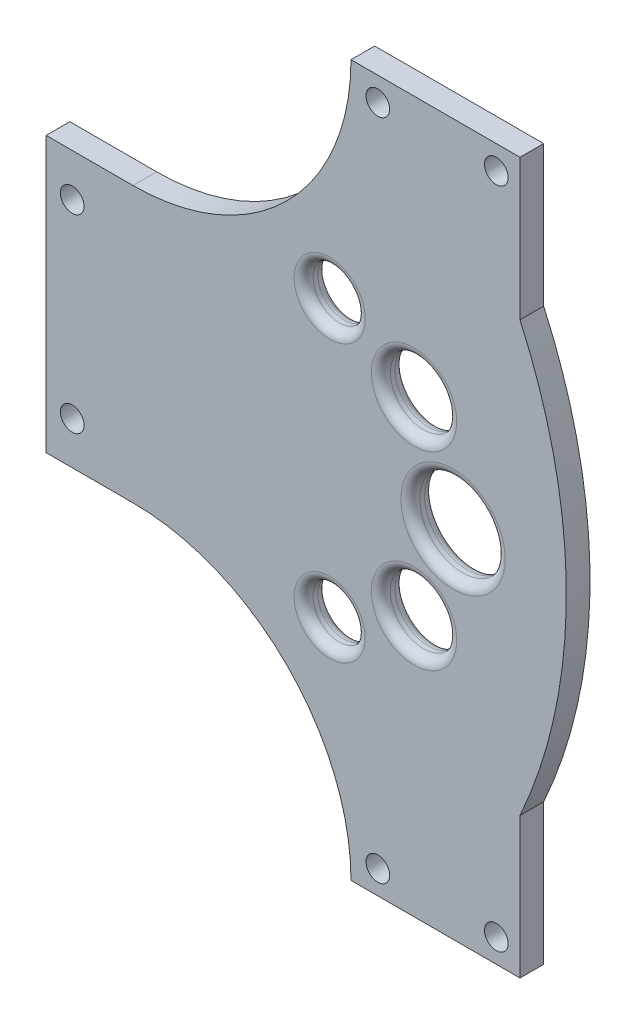
ISO-10303-21;
HEADER;
FILE_DESCRIPTION(('STEP AP214'),'2;1');
FILE_NAME('part.step','',(''),(''),'','','');
FILE_SCHEMA(('AUTOMOTIVE_DESIGN { 1 0 10303 214 1 1 1 1 }'));
ENDSEC;
DATA;
#1=APPLICATION_CONTEXT('core data for automotive mechanical design processes');
#2=APPLICATION_PROTOCOL_DEFINITION('international standard','automotive_design',2000,#1);
#3=PRODUCT_CONTEXT('',#1,'mechanical');
#4=PRODUCT('Part','Part','',(#3));
#5=PRODUCT_RELATED_PRODUCT_CATEGORY('part','',(#4));
#6=PRODUCT_DEFINITION_FORMATION('','',#4);
#7=PRODUCT_DEFINITION_CONTEXT('part definition',#1,'design');
#8=PRODUCT_DEFINITION('design','',#6,#7);
#9=PRODUCT_DEFINITION_SHAPE('','',#8);
#10=(LENGTH_UNIT() NAMED_UNIT(*) SI_UNIT(.MILLI.,.METRE.));
#11=(NAMED_UNIT(*) PLANE_ANGLE_UNIT() SI_UNIT($,.RADIAN.));
#12=(NAMED_UNIT(*) SI_UNIT($,.STERADIAN.) SOLID_ANGLE_UNIT());
#13=UNCERTAINTY_MEASURE_WITH_UNIT(LENGTH_MEASURE(1.E-05),#10,'distance_accuracy_value','');
#14=(GEOMETRIC_REPRESENTATION_CONTEXT(3) GLOBAL_UNCERTAINTY_ASSIGNED_CONTEXT((#13)) GLOBAL_UNIT_ASSIGNED_CONTEXT((#10,
#11,#12)) REPRESENTATION_CONTEXT('',''));
#15=CARTESIAN_POINT('',(0.,0.,0.));
#16=DIRECTION('',(0.,0.,1.));
#17=DIRECTION('',(1.,0.,0.));
#18=AXIS2_PLACEMENT_3D('',#15,#16,#17);
#19=CARTESIAN_POINT('',(0.,0.,5.));
#20=DIRECTION('',(0.,1.,0.));
#21=DIRECTION('',(-1.,0.,0.));
#22=AXIS2_PLACEMENT_3D('',#19,#20,#21);
#23=PLANE('',#22);
#24=DIRECTION('',(1.,0.,0.));
#25=VECTOR('',#24,1.);
#26=CARTESIAN_POINT('',(0.,0.,0.));
#27=LINE('',#26,#25);
#28=CARTESIAN_POINT('',(0.,0.,0.));
#29=VERTEX_POINT('',#28);
#30=CARTESIAN_POINT('',(18.3344584571435,0.,0.));
#31=VERTEX_POINT('',#30);
#32=EDGE_CURVE('E150',#29,#31,#27,.T.);
#33=ORIENTED_EDGE('',*,*,#32,.T.);
#34=DIRECTION('',(0.,0.,-1.));
#35=VECTOR('',#34,1.);
#36=CARTESIAN_POINT('',(18.3344584571435,0.,5.));
#37=LINE('',#36,#35);
#38=CARTESIAN_POINT('',(18.3344584571435,0.,5.));
#39=VERTEX_POINT('',#38);
#40=EDGE_CURVE('E188',#39,#31,#37,.T.);
#41=ORIENTED_EDGE('',*,*,#40,.F.);
#42=DIRECTION('',(1.,0.,0.));
#43=VECTOR('',#42,1.);
#44=CARTESIAN_POINT('',(0.,0.,5.));
#45=LINE('',#44,#43);
#46=CARTESIAN_POINT('',(0.,0.,5.));
#47=VERTEX_POINT('',#46);
#48=EDGE_CURVE('E169',#47,#39,#45,.T.);
#49=ORIENTED_EDGE('',*,*,#48,.F.);
#50=DIRECTION('',(0.,0.,-1.));
#51=VECTOR('',#50,1.);
#52=CARTESIAN_POINT('',(0.,0.,5.));
#53=LINE('',#52,#51);
#54=EDGE_CURVE('E146',#47,#29,#53,.T.);
#55=ORIENTED_EDGE('',*,*,#54,.T.);
#56=EDGE_LOOP('',(#33,#41,#49,#55));
#57=FACE_BOUND('',#56,.T.);
#58=ADVANCED_FACE('F38',(#57),#23,.F.);
#59=CARTESIAN_POINT('',(18.3344584571435,-46.,5.));
#60=DIRECTION('',(0.,0.,-1.));
#61=DIRECTION('',(-1.,0.,0.));
#62=AXIS2_PLACEMENT_3D('',#59,#60,#61);
#63=CYLINDRICAL_SURFACE('',#62,46.);
#64=CARTESIAN_POINT('',(18.3344584571435,-46.,0.));
#65=DIRECTION('',(0.,0.,-1.));
#66=DIRECTION('',(1.,0.,0.));
#67=AXIS2_PLACEMENT_3D('',#64,#65,#66);
#68=CIRCLE('',#67,46.);
#69=CARTESIAN_POINT('',(64.3344584571435,-46.,0.));
#70=VERTEX_POINT('',#69);
#71=EDGE_CURVE('E153',#31,#70,#68,.T.);
#72=ORIENTED_EDGE('',*,*,#71,.T.);
#73=DIRECTION('',(0.,0.,-1.));
#74=VECTOR('',#73,1.);
#75=CARTESIAN_POINT('',(64.3344584571435,-46.,5.));
#76=LINE('',#75,#74);
#77=CARTESIAN_POINT('',(64.3344584571435,-46.,5.));
#78=VERTEX_POINT('',#77);
#79=EDGE_CURVE('E185',#78,#70,#76,.T.);
#80=ORIENTED_EDGE('',*,*,#79,.F.);
#81=CARTESIAN_POINT('',(18.3344584571435,-46.,5.));
#82=DIRECTION('',(0.,0.,-1.));
#83=DIRECTION('',(1.,0.,0.));
#84=AXIS2_PLACEMENT_3D('',#81,#82,#83);
#85=CIRCLE('',#84,46.);
#86=EDGE_CURVE('E107',#39,#78,#85,.T.);
#87=ORIENTED_EDGE('',*,*,#86,.F.);
#88=ORIENTED_EDGE('',*,*,#40,.T.);
#89=EDGE_LOOP('',(#72,#80,#87,#88));
#90=FACE_BOUND('',#89,.T.);
#91=ADVANCED_FACE('F313',(#90),#63,.F.);
#92=CARTESIAN_POINT('',(64.3344584571435,-46.,5.));
#93=DIRECTION('',(0.,1.,0.));
#94=DIRECTION('',(-1.,0.,0.));
#95=AXIS2_PLACEMENT_3D('',#92,#93,#94);
#96=PLANE('',#95);
#97=DIRECTION('',(1.,0.,0.));
#98=VECTOR('',#97,1.);
#99=CARTESIAN_POINT('',(64.3344584571435,-46.,0.));
#100=LINE('',#99,#98);
#101=CARTESIAN_POINT('',(100.,-46.,0.));
#102=VERTEX_POINT('',#101);
#103=EDGE_CURVE('E156',#70,#102,#100,.T.);
#104=ORIENTED_EDGE('',*,*,#103,.T.);
#105=DIRECTION('',(0.,0.,-1.));
#106=VECTOR('',#105,1.);
#107=CARTESIAN_POINT('',(100.,-46.,5.));
#108=LINE('',#107,#106);
#109=CARTESIAN_POINT('',(100.,-46.,5.));
#110=VERTEX_POINT('',#109);
#111=EDGE_CURVE('E182',#110,#102,#108,.T.);
#112=ORIENTED_EDGE('',*,*,#111,.F.);
#113=DIRECTION('',(1.,0.,0.));
#114=VECTOR('',#113,1.);
#115=CARTESIAN_POINT('',(64.3344584571435,-46.,5.));
#116=LINE('',#115,#114);
#117=EDGE_CURVE('E276',#78,#110,#116,.T.);
#118=ORIENTED_EDGE('',*,*,#117,.F.);
#119=ORIENTED_EDGE('',*,*,#79,.T.);
#120=EDGE_LOOP('',(#104,#112,#118,#119));
#121=FACE_BOUND('',#120,.T.);
#122=ADVANCED_FACE('F318',(#121),#96,.F.);
#123=CARTESIAN_POINT('',(100.,-46.,5.));
#124=DIRECTION('',(-1.,0.,0.));
#125=DIRECTION('',(0.,0.,1.));
#126=AXIS2_PLACEMENT_3D('',#123,#124,#125);
#127=PLANE('',#126);
#128=DIRECTION('',(0.,1.,0.));
#129=VECTOR('',#128,1.);
#130=CARTESIAN_POINT('',(100.,-46.,0.));
#131=LINE('',#130,#129);
#132=CARTESIAN_POINT('',(100.,-16.2880938118282,0.));
#133=VERTEX_POINT('',#132);
#134=EDGE_CURVE('E158',#102,#133,#131,.T.);
#135=ORIENTED_EDGE('',*,*,#134,.T.);
#136=DIRECTION('',(0.,0.,-1.));
#137=VECTOR('',#136,1.);
#138=CARTESIAN_POINT('',(100.,-16.2880938118282,5.));
#139=LINE('',#138,#137);
#140=CARTESIAN_POINT('',(100.,-16.2880938118282,5.));
#141=VERTEX_POINT('',#140);
#142=EDGE_CURVE('E179',#141,#133,#139,.T.);
#143=ORIENTED_EDGE('',*,*,#142,.F.);
#144=DIRECTION('',(0.,1.,0.));
#145=VECTOR('',#144,1.);
#146=CARTESIAN_POINT('',(100.,-46.,5.));
#147=LINE('',#146,#145);
#148=EDGE_CURVE('E278',#110,#141,#147,.T.);
#149=ORIENTED_EDGE('',*,*,#148,.F.);
#150=ORIENTED_EDGE('',*,*,#111,.T.);
#151=EDGE_LOOP('',(#135,#143,#149,#150));
#152=FACE_BOUND('',#151,.T.);
#153=ADVANCED_FACE('F641',(#152),#127,.F.);
#154=CARTESIAN_POINT('',(0.,29.,5.));
#155=DIRECTION('',(0.,0.,-1.));
#156=DIRECTION('',(-1.,0.,0.));
#157=AXIS2_PLACEMENT_3D('',#154,#155,#156);
#158=CYLINDRICAL_SURFACE('',#157,109.777098891841);
#159=CARTESIAN_POINT('',(0.,29.,0.));
#160=DIRECTION('',(0.,0.,1.));
#161=DIRECTION('',(-1.,0.,0.));
#162=AXIS2_PLACEMENT_3D('',#159,#160,#161);
#163=CIRCLE('',#162,109.777098891841);
#164=CARTESIAN_POINT('',(100.,74.2880938118283,0.));
#165=VERTEX_POINT('',#164);
#166=EDGE_CURVE('E160',#133,#165,#163,.T.);
#167=ORIENTED_EDGE('',*,*,#166,.T.);
#168=DIRECTION('',(0.,0.,-1.));
#169=VECTOR('',#168,1.);
#170=CARTESIAN_POINT('',(100.,74.2880938118283,5.));
#171=LINE('',#170,#169);
#172=CARTESIAN_POINT('',(100.,74.2880938118283,5.));
#173=VERTEX_POINT('',#172);
#174=EDGE_CURVE('E176',#173,#165,#171,.T.);
#175=ORIENTED_EDGE('',*,*,#174,.F.);
#176=CARTESIAN_POINT('',(0.,29.,5.));
#177=DIRECTION('',(0.,0.,1.));
#178=DIRECTION('',(-1.,0.,0.));
#179=AXIS2_PLACEMENT_3D('',#176,#177,#178);
#180=CIRCLE('',#179,109.777098891841);
#181=EDGE_CURVE('E280',#141,#173,#180,.T.);
#182=ORIENTED_EDGE('',*,*,#181,.F.);
#183=ORIENTED_EDGE('',*,*,#142,.T.);
#184=EDGE_LOOP('',(#167,#175,#182,#183));
#185=FACE_BOUND('',#184,.T.);
#186=ADVANCED_FACE('F633',(#185),#158,.T.);
#187=CARTESIAN_POINT('',(100.,104.,5.));
#188=DIRECTION('',(-1.,0.,0.));
#189=DIRECTION('',(0.,0.,1.));
#190=AXIS2_PLACEMENT_3D('',#187,#188,#189);
#191=PLANE('',#190);
#192=DIRECTION('',(0.,1.,0.));
#193=VECTOR('',#192,1.);
#194=CARTESIAN_POINT('',(100.,104.,0.));
#195=LINE('',#194,#193);
#196=CARTESIAN_POINT('',(100.,104.,0.));
#197=VERTEX_POINT('',#196);
#198=EDGE_CURVE('E162',#165,#197,#195,.T.);
#199=ORIENTED_EDGE('',*,*,#198,.T.);
#200=DIRECTION('',(0.,0.,-1.));
#201=VECTOR('',#200,1.);
#202=CARTESIAN_POINT('',(100.,104.,5.));
#203=LINE('',#202,#201);
#204=CARTESIAN_POINT('',(100.,104.,5.));
#205=VERTEX_POINT('',#204);
#206=EDGE_CURVE('E173',#205,#197,#203,.T.);
#207=ORIENTED_EDGE('',*,*,#206,.F.);
#208=DIRECTION('',(0.,1.,0.));
#209=VECTOR('',#208,1.);
#210=CARTESIAN_POINT('',(100.,104.,5.));
#211=LINE('',#210,#209);
#212=EDGE_CURVE('E282',#173,#205,#211,.T.);
#213=ORIENTED_EDGE('',*,*,#212,.F.);
#214=ORIENTED_EDGE('',*,*,#174,.T.);
#215=EDGE_LOOP('',(#199,#207,#213,#214));
#216=FACE_BOUND('',#215,.T.);
#217=ADVANCED_FACE('F288',(#216),#191,.F.);
#218=CARTESIAN_POINT('',(64.3344584571435,104.,5.));
#219=DIRECTION('',(0.,-1.,0.));
#220=DIRECTION('',(1.,0.,0.));
#221=AXIS2_PLACEMENT_3D('',#218,#219,#220);
#222=PLANE('',#221);
#223=DIRECTION('',(-1.,0.,0.));
#224=VECTOR('',#223,1.);
#225=CARTESIAN_POINT('',(64.3344584571435,104.,0.));
#226=LINE('',#225,#224);
#227=CARTESIAN_POINT('',(64.3344584571435,104.,0.));
#228=VERTEX_POINT('',#227);
#229=EDGE_CURVE('E164',#197,#228,#226,.T.);
#230=ORIENTED_EDGE('',*,*,#229,.T.);
#231=DIRECTION('',(0.,0.,-1.));
#232=VECTOR('',#231,1.);
#233=CARTESIAN_POINT('',(64.3344584571435,104.,5.));
#234=LINE('',#233,#232);
#235=CARTESIAN_POINT('',(64.3344584571435,104.,5.));
#236=VERTEX_POINT('',#235);
#237=EDGE_CURVE('E141',#236,#228,#234,.T.);
#238=ORIENTED_EDGE('',*,*,#237,.F.);
#239=DIRECTION('',(-1.,0.,0.));
#240=VECTOR('',#239,1.);
#241=CARTESIAN_POINT('',(64.3344584571435,104.,5.));
#242=LINE('',#241,#240);
#243=EDGE_CURVE('E132',#205,#236,#242,.T.);
#244=ORIENTED_EDGE('',*,*,#243,.F.);
#245=ORIENTED_EDGE('',*,*,#206,.T.);
#246=EDGE_LOOP('',(#230,#238,#244,#245));
#247=FACE_BOUND('',#246,.T.);
#248=ADVANCED_FACE('F292',(#247),#222,.F.);
#249=CARTESIAN_POINT('',(18.3344584571435,104.,5.));
#250=DIRECTION('',(0.,0.,-1.));
#251=DIRECTION('',(-1.,0.,0.));
#252=AXIS2_PLACEMENT_3D('',#249,#250,#251);
#253=CYLINDRICAL_SURFACE('',#252,46.);
#254=CARTESIAN_POINT('',(18.3344584571435,104.,0.));
#255=DIRECTION('',(0.,0.,-1.));
#256=DIRECTION('',(-1.,0.,0.));
#257=AXIS2_PLACEMENT_3D('',#254,#255,#256);
#258=CIRCLE('',#257,46.);
#259=CARTESIAN_POINT('',(18.3344584571435,58.,0.));
#260=VERTEX_POINT('',#259);
#261=EDGE_CURVE('E140',#228,#260,#258,.T.);
#262=ORIENTED_EDGE('',*,*,#261,.T.);
#263=DIRECTION('',(0.,0.,-1.));
#264=VECTOR('',#263,1.);
#265=CARTESIAN_POINT('',(18.3344584571435,58.,5.));
#266=LINE('',#265,#264);
#267=CARTESIAN_POINT('',(18.3344584571435,58.,5.));
#268=VERTEX_POINT('',#267);
#269=EDGE_CURVE('E137',#268,#260,#266,.T.);
#270=ORIENTED_EDGE('',*,*,#269,.F.);
#271=CARTESIAN_POINT('',(18.3344584571435,104.,5.));
#272=DIRECTION('',(0.,0.,-1.));
#273=DIRECTION('',(-1.,0.,0.));
#274=AXIS2_PLACEMENT_3D('',#271,#272,#273);
#275=CIRCLE('',#274,46.);
#276=EDGE_CURVE('E126',#236,#268,#275,.T.);
#277=ORIENTED_EDGE('',*,*,#276,.F.);
#278=ORIENTED_EDGE('',*,*,#237,.T.);
#279=EDGE_LOOP('',(#262,#270,#277,#278));
#280=FACE_BOUND('',#279,.T.);
#281=ADVANCED_FACE('F138',(#280),#253,.F.);
#282=CARTESIAN_POINT('',(0.,58.,5.));
#283=DIRECTION('',(0.,-1.,0.));
#284=DIRECTION('',(0.,0.,-1.));
#285=AXIS2_PLACEMENT_3D('',#282,#283,#284);
#286=PLANE('',#285);
#287=DIRECTION('',(-1.,0.,0.));
#288=VECTOR('',#287,1.);
#289=CARTESIAN_POINT('',(0.,58.,0.));
#290=LINE('',#289,#288);
#291=CARTESIAN_POINT('',(0.,58.,0.));
#292=VERTEX_POINT('',#291);
#293=EDGE_CURVE('E92',#260,#292,#290,.T.);
#294=ORIENTED_EDGE('',*,*,#293,.T.);
#295=DIRECTION('',(0.,0.,-1.));
#296=VECTOR('',#295,1.);
#297=CARTESIAN_POINT('',(0.,58.,5.));
#298=LINE('',#297,#296);
#299=CARTESIAN_POINT('',(0.,58.,5.));
#300=VERTEX_POINT('',#299);
#301=EDGE_CURVE('E142',#300,#292,#298,.T.);
#302=ORIENTED_EDGE('',*,*,#301,.F.);
#303=DIRECTION('',(-1.,0.,0.));
#304=VECTOR('',#303,1.);
#305=CARTESIAN_POINT('',(0.,58.,5.));
#306=LINE('',#305,#304);
#307=EDGE_CURVE('E130',#268,#300,#306,.T.);
#308=ORIENTED_EDGE('',*,*,#307,.F.);
#309=ORIENTED_EDGE('',*,*,#269,.T.);
#310=EDGE_LOOP('',(#294,#302,#308,#309));
#311=FACE_BOUND('',#310,.T.);
#312=ADVANCED_FACE('F144',(#311),#286,.F.);
#313=CARTESIAN_POINT('',(0.,0.,5.));
#314=DIRECTION('',(1.,0.,0.));
#315=DIRECTION('',(0.,0.,-1.));
#316=AXIS2_PLACEMENT_3D('',#313,#314,#315);
#317=PLANE('',#316);
#318=DIRECTION('',(0.,-1.,0.));
#319=VECTOR('',#318,1.);
#320=CARTESIAN_POINT('',(0.,0.,0.));
#321=LINE('',#320,#319);
#322=EDGE_CURVE('E98',#292,#29,#321,.T.);
#323=ORIENTED_EDGE('',*,*,#322,.T.);
#324=ORIENTED_EDGE('',*,*,#54,.F.);
#325=DIRECTION('',(0.,-1.,0.));
#326=VECTOR('',#325,1.);
#327=CARTESIAN_POINT('',(0.,0.,5.));
#328=LINE('',#327,#326);
#329=EDGE_CURVE('E57',#300,#47,#328,.T.);
#330=ORIENTED_EDGE('',*,*,#329,.F.);
#331=ORIENTED_EDGE('',*,*,#301,.T.);
#332=EDGE_LOOP('',(#323,#324,#330,#331));
#333=FACE_BOUND('',#332,.T.);
#334=ADVANCED_FACE('F300',(#333),#317,.F.);
#335=CARTESIAN_POINT('',(18.3344584571435,-46.,5.));
#336=DIRECTION('',(0.,0.,1.));
#337=DIRECTION('',(1.,0.,0.));
#338=AXIS2_PLACEMENT_3D('',#335,#336,#337);
#339=PLANE('',#338);
#340=CARTESIAN_POINT('',(95.,-41.,5.));
#341=DIRECTION('',(0.,0.,1.));
#342=DIRECTION('',(1.,0.,0.));
#343=AXIS2_PLACEMENT_3D('',#340,#341,#342);
#344=CIRCLE('',#343,2.5);
#345=CARTESIAN_POINT('',(97.5,-41.,5.));
#346=VERTEX_POINT('',#345);
#347=EDGE_CURVE('E469',#346,#346,#344,.T.);
#348=ORIENTED_EDGE('',*,*,#347,.F.);
#349=EDGE_LOOP('',(#348));
#350=FACE_BOUND('',#349,.T.);
#351=CARTESIAN_POINT('',(70.,99.,5.));
#352=DIRECTION('',(0.,0.,1.));
#353=DIRECTION('',(-1.,0.,0.));
#354=AXIS2_PLACEMENT_3D('',#351,#352,#353);
#355=CIRCLE('',#354,2.5);
#356=CARTESIAN_POINT('',(67.5,99.,5.));
#357=VERTEX_POINT('',#356);
#358=EDGE_CURVE('E466',#357,#357,#355,.T.);
#359=ORIENTED_EDGE('',*,*,#358,.F.);
#360=EDGE_LOOP('',(#359));
#361=FACE_BOUND('',#360,.T.);
#362=CARTESIAN_POINT('',(95.,99.,5.));
#363=DIRECTION('',(0.,0.,1.));
#364=DIRECTION('',(-1.,0.,0.));
#365=AXIS2_PLACEMENT_3D('',#362,#363,#364);
#366=CIRCLE('',#365,2.5);
#367=CARTESIAN_POINT('',(92.5,99.,5.));
#368=VERTEX_POINT('',#367);
#369=EDGE_CURVE('E464',#368,#368,#366,.T.);
#370=ORIENTED_EDGE('',*,*,#369,.F.);
#371=EDGE_LOOP('',(#370));
#372=FACE_BOUND('',#371,.T.);
#373=CARTESIAN_POINT('',(70.,-41.,5.));
#374=DIRECTION('',(0.,0.,1.));
#375=DIRECTION('',(1.,0.,0.));
#376=AXIS2_PLACEMENT_3D('',#373,#374,#375);
#377=CIRCLE('',#376,2.5);
#378=CARTESIAN_POINT('',(72.5,-41.,5.));
#379=VERTEX_POINT('',#378);
#380=EDGE_CURVE('E256',#379,#379,#377,.T.);
#381=ORIENTED_EDGE('',*,*,#380,.F.);
#382=EDGE_LOOP('',(#381));
#383=FACE_BOUND('',#382,.T.);
#384=CARTESIAN_POINT('',(5.5,49.,5.));
#385=DIRECTION('',(0.,0.,1.));
#386=DIRECTION('',(1.,0.,0.));
#387=AXIS2_PLACEMENT_3D('',#384,#385,#386);
#388=CIRCLE('',#387,2.5);
#389=CARTESIAN_POINT('',(8.,49.,5.));
#390=VERTEX_POINT('',#389);
#391=EDGE_CURVE('E249',#390,#390,#388,.T.);
#392=ORIENTED_EDGE('',*,*,#391,.F.);
#393=EDGE_LOOP('',(#392));
#394=FACE_BOUND('',#393,.T.);
#395=CARTESIAN_POINT('',(5.50000000000001,8.99999999999999,5.));
#396=DIRECTION('',(0.,0.,1.));
#397=DIRECTION('',(1.,0.,0.));
#398=AXIS2_PLACEMENT_3D('',#395,#396,#397);
#399=CIRCLE('',#398,2.5);
#400=CARTESIAN_POINT('',(8.00000000000001,8.99999999999999,5.));
#401=VERTEX_POINT('',#400);
#402=EDGE_CURVE('E263',#401,#401,#399,.T.);
#403=ORIENTED_EDGE('',*,*,#402,.F.);
#404=EDGE_LOOP('',(#403));
#405=FACE_BOUND('',#404,.T.);
#406=CARTESIAN_POINT('',(59.840097388612,-0.167904281484152,5.));
#407=DIRECTION('',(0.,0.,1.));
#408=DIRECTION('',(1.,0.,0.));
#409=AXIS2_PLACEMENT_3D('',#406,#407,#408);
#410=CIRCLE('',#409,7.50000000000001);
#411=CARTESIAN_POINT('',(67.340097388612,-0.167904281484152,5.));
#412=VERTEX_POINT('',#411);
#413=EDGE_CURVE('E11',#412,#412,#410,.F.);
#414=ORIENTED_EDGE('',*,*,#413,.T.);
#415=EDGE_LOOP('',(#414));
#416=FACE_BOUND('',#415,.T.);
#417=CARTESIAN_POINT('',(77.6410161513774,8.99999999999999,5.));
#418=DIRECTION('',(0.,0.,1.));
#419=DIRECTION('',(1.,0.,0.));
#420=AXIS2_PLACEMENT_3D('',#417,#418,#419);
#421=CIRCLE('',#420,9.);
#422=CARTESIAN_POINT('',(86.6410161513774,8.99999999999999,5.));
#423=VERTEX_POINT('',#422);
#424=EDGE_CURVE('E48',#423,#423,#421,.F.);
#425=ORIENTED_EDGE('',*,*,#424,.T.);
#426=EDGE_LOOP('',(#425));
#427=FACE_BOUND('',#426,.T.);
#428=CARTESIAN_POINT('',(85.8761294990678,29.,5.));
#429=DIRECTION('',(0.,0.,1.));
#430=DIRECTION('',(1.,0.,0.));
#431=AXIS2_PLACEMENT_3D('',#428,#429,#430);
#432=CIRCLE('',#431,11.);
#433=CARTESIAN_POINT('',(96.8761294990678,29.,5.));
#434=VERTEX_POINT('',#433);
#435=EDGE_CURVE('E241',#434,#434,#432,.F.);
#436=ORIENTED_EDGE('',*,*,#435,.T.);
#437=EDGE_LOOP('',(#436));
#438=FACE_BOUND('',#437,.T.);
#439=CARTESIAN_POINT('',(77.6410161513774,49.,5.));
#440=DIRECTION('',(0.,0.,1.));
#441=DIRECTION('',(1.,0.,0.));
#442=AXIS2_PLACEMENT_3D('',#439,#440,#441);
#443=CIRCLE('',#442,9.);
#444=CARTESIAN_POINT('',(86.6410161513774,49.,5.));
#445=VERTEX_POINT('',#444);
#446=EDGE_CURVE('E238',#445,#445,#443,.F.);
#447=ORIENTED_EDGE('',*,*,#446,.T.);
#448=EDGE_LOOP('',(#447));
#449=FACE_BOUND('',#448,.T.);
#450=CARTESIAN_POINT('',(59.840097388612,58.1679042814841,5.));
#451=DIRECTION('',(0.,0.,1.));
#452=DIRECTION('',(1.,0.,0.));
#453=AXIS2_PLACEMENT_3D('',#450,#451,#452);
#454=CIRCLE('',#453,7.50000000000001);
#455=CARTESIAN_POINT('',(67.340097388612,58.1679042814841,5.));
#456=VERTEX_POINT('',#455);
#457=EDGE_CURVE('E235',#456,#456,#454,.F.);
#458=ORIENTED_EDGE('',*,*,#457,.T.);
#459=EDGE_LOOP('',(#458));
#460=FACE_BOUND('',#459,.T.);
#461=ORIENTED_EDGE('',*,*,#48,.T.);
#462=ORIENTED_EDGE('',*,*,#86,.T.);
#463=ORIENTED_EDGE('',*,*,#117,.T.);
#464=ORIENTED_EDGE('',*,*,#148,.T.);
#465=ORIENTED_EDGE('',*,*,#181,.T.);
#466=ORIENTED_EDGE('',*,*,#212,.T.);
#467=ORIENTED_EDGE('',*,*,#243,.T.);
#468=ORIENTED_EDGE('',*,*,#276,.T.);
#469=ORIENTED_EDGE('',*,*,#307,.T.);
#470=ORIENTED_EDGE('',*,*,#329,.T.);
#471=EDGE_LOOP('',(#461,#462,#463,#464,#465,#466,#467,#468,#469,#470));
#472=FACE_BOUND('',#471,.T.);
#473=ADVANCED_FACE('F128',(#350,#361,#372,#383,#394,#405,#416,#427,#438,#449,#460,#472),#339,.T.);
#474=CARTESIAN_POINT('',(18.3344584571435,-46.,0.));
#475=DIRECTION('',(0.,0.,1.));
#476=DIRECTION('',(1.,0.,0.));
#477=AXIS2_PLACEMENT_3D('',#474,#475,#476);
#478=PLANE('',#477);
#479=CARTESIAN_POINT('',(95.,-41.,0.));
#480=DIRECTION('',(0.,0.,1.));
#481=DIRECTION('',(1.,0.,0.));
#482=AXIS2_PLACEMENT_3D('',#479,#480,#481);
#483=CIRCLE('',#482,2.5);
#484=CARTESIAN_POINT('',(97.5,-41.,0.));
#485=VERTEX_POINT('',#484);
#486=EDGE_CURVE('E42',#485,#485,#483,.T.);
#487=ORIENTED_EDGE('',*,*,#486,.T.);
#488=EDGE_LOOP('',(#487));
#489=FACE_BOUND('',#488,.T.);
#490=CARTESIAN_POINT('',(70.,99.,0.));
#491=DIRECTION('',(0.,0.,1.));
#492=DIRECTION('',(1.,0.,0.));
#493=AXIS2_PLACEMENT_3D('',#490,#491,#492);
#494=CIRCLE('',#493,2.5);
#495=CARTESIAN_POINT('',(72.5,99.,0.));
#496=VERTEX_POINT('',#495);
#497=EDGE_CURVE('E258',#496,#496,#494,.T.);
#498=ORIENTED_EDGE('',*,*,#497,.T.);
#499=EDGE_LOOP('',(#498));
#500=FACE_BOUND('',#499,.T.);
#501=CARTESIAN_POINT('',(95.,99.,0.));
#502=DIRECTION('',(0.,0.,1.));
#503=DIRECTION('',(1.,0.,0.));
#504=AXIS2_PLACEMENT_3D('',#501,#502,#503);
#505=CIRCLE('',#504,2.5);
#506=CARTESIAN_POINT('',(97.5,99.,0.));
#507=VERTEX_POINT('',#506);
#508=EDGE_CURVE('E255',#507,#507,#505,.T.);
#509=ORIENTED_EDGE('',*,*,#508,.T.);
#510=EDGE_LOOP('',(#509));
#511=FACE_BOUND('',#510,.T.);
#512=CARTESIAN_POINT('',(70.,-41.,0.));
#513=DIRECTION('',(0.,0.,1.));
#514=DIRECTION('',(1.,0.,0.));
#515=AXIS2_PLACEMENT_3D('',#512,#513,#514);
#516=CIRCLE('',#515,2.5);
#517=CARTESIAN_POINT('',(72.5,-41.,0.));
#518=VERTEX_POINT('',#517);
#519=EDGE_CURVE('E252',#518,#518,#516,.T.);
#520=ORIENTED_EDGE('',*,*,#519,.T.);
#521=EDGE_LOOP('',(#520));
#522=FACE_BOUND('',#521,.T.);
#523=CARTESIAN_POINT('',(5.5,49.,0.));
#524=DIRECTION('',(0.,0.,1.));
#525=DIRECTION('',(1.,0.,0.));
#526=AXIS2_PLACEMENT_3D('',#523,#524,#525);
#527=CIRCLE('',#526,2.5);
#528=CARTESIAN_POINT('',(8.,49.,0.));
#529=VERTEX_POINT('',#528);
#530=EDGE_CURVE('E154',#529,#529,#527,.T.);
#531=ORIENTED_EDGE('',*,*,#530,.T.);
#532=EDGE_LOOP('',(#531));
#533=FACE_BOUND('',#532,.T.);
#534=CARTESIAN_POINT('',(5.50000000000001,8.99999999999999,0.));
#535=DIRECTION('',(0.,0.,1.));
#536=DIRECTION('',(1.,0.,0.));
#537=AXIS2_PLACEMENT_3D('',#534,#535,#536);
#538=CIRCLE('',#537,2.5);
#539=CARTESIAN_POINT('',(8.00000000000001,8.99999999999999,0.));
#540=VERTEX_POINT('',#539);
#541=EDGE_CURVE('E246',#540,#540,#538,.T.);
#542=ORIENTED_EDGE('',*,*,#541,.T.);
#543=EDGE_LOOP('',(#542));
#544=FACE_BOUND('',#543,.T.);
#545=CARTESIAN_POINT('',(59.840097388612,-0.167904281484152,0.));
#546=DIRECTION('',(0.,0.,1.));
#547=DIRECTION('',(1.,0.,0.));
#548=AXIS2_PLACEMENT_3D('',#545,#546,#547);
#549=CIRCLE('',#548,7.50000000000001);
#550=CARTESIAN_POINT('',(67.340097388612,-0.167904281484152,0.));
#551=VERTEX_POINT('',#550);
#552=EDGE_CURVE('E208',#551,#551,#549,.T.);
#553=ORIENTED_EDGE('',*,*,#552,.T.);
#554=EDGE_LOOP('',(#553));
#555=FACE_BOUND('',#554,.T.);
#556=CARTESIAN_POINT('',(77.6410161513774,8.99999999999999,0.));
#557=DIRECTION('',(0.,0.,1.));
#558=DIRECTION('',(1.,0.,0.));
#559=AXIS2_PLACEMENT_3D('',#556,#557,#558);
#560=CIRCLE('',#559,9.);
#561=CARTESIAN_POINT('',(86.6410161513774,8.99999999999999,0.));
#562=VERTEX_POINT('',#561);
#563=EDGE_CURVE('E205',#562,#562,#560,.T.);
#564=ORIENTED_EDGE('',*,*,#563,.T.);
#565=EDGE_LOOP('',(#564));
#566=FACE_BOUND('',#565,.T.);
#567=CARTESIAN_POINT('',(85.8761294990678,29.,0.));
#568=DIRECTION('',(0.,0.,1.));
#569=DIRECTION('',(1.,0.,0.));
#570=AXIS2_PLACEMENT_3D('',#567,#568,#569);
#571=CIRCLE('',#570,11.);
#572=CARTESIAN_POINT('',(96.8761294990678,29.,0.));
#573=VERTEX_POINT('',#572);
#574=EDGE_CURVE('E202',#573,#573,#571,.T.);
#575=ORIENTED_EDGE('',*,*,#574,.T.);
#576=EDGE_LOOP('',(#575));
#577=FACE_BOUND('',#576,.T.);
#578=CARTESIAN_POINT('',(77.6410161513774,49.,0.));
#579=DIRECTION('',(0.,0.,1.));
#580=DIRECTION('',(1.,0.,0.));
#581=AXIS2_PLACEMENT_3D('',#578,#579,#580);
#582=CIRCLE('',#581,9.);
#583=CARTESIAN_POINT('',(86.6410161513774,49.,0.));
#584=VERTEX_POINT('',#583);
#585=EDGE_CURVE('E199',#584,#584,#582,.T.);
#586=ORIENTED_EDGE('',*,*,#585,.T.);
#587=EDGE_LOOP('',(#586));
#588=FACE_BOUND('',#587,.T.);
#589=CARTESIAN_POINT('',(59.840097388612,58.1679042814841,0.));
#590=DIRECTION('',(0.,0.,1.));
#591=DIRECTION('',(1.,0.,0.));
#592=AXIS2_PLACEMENT_3D('',#589,#590,#591);
#593=CIRCLE('',#592,7.50000000000001);
#594=CARTESIAN_POINT('',(67.340097388612,58.1679042814841,0.));
#595=VERTEX_POINT('',#594);
#596=EDGE_CURVE('E196',#595,#595,#593,.T.);
#597=ORIENTED_EDGE('',*,*,#596,.T.);
#598=EDGE_LOOP('',(#597));
#599=FACE_BOUND('',#598,.T.);
#600=ORIENTED_EDGE('',*,*,#32,.F.);
#601=ORIENTED_EDGE('',*,*,#322,.F.);
#602=ORIENTED_EDGE('',*,*,#293,.F.);
#603=ORIENTED_EDGE('',*,*,#261,.F.);
#604=ORIENTED_EDGE('',*,*,#229,.F.);
#605=ORIENTED_EDGE('',*,*,#198,.F.);
#606=ORIENTED_EDGE('',*,*,#166,.F.);
#607=ORIENTED_EDGE('',*,*,#134,.F.);
#608=ORIENTED_EDGE('',*,*,#103,.F.);
#609=ORIENTED_EDGE('',*,*,#71,.F.);
#610=EDGE_LOOP('',(#600,#601,#602,#603,#604,#605,#606,#607,#608,#609));
#611=FACE_BOUND('',#610,.T.);
#612=ADVANCED_FACE('F295',(#489,#500,#511,#522,#533,#544,#555,#566,#577,#588,#599,#611),#478,.F.);
#613=CARTESIAN_POINT('',(59.840097388612,58.1679042814841,5.));
#614=DIRECTION('',(0.,0.,-1.));
#615=DIRECTION('',(-1.,0.,0.));
#616=AXIS2_PLACEMENT_3D('',#613,#614,#615);
#617=CYLINDRICAL_SURFACE('',#616,5.50000000000001);
#618=CARTESIAN_POINT('',(59.840097388612,58.1679042814841,2.));
#619=DIRECTION('',(0.,0.,1.));
#620=DIRECTION('',(1.,0.,0.));
#621=AXIS2_PLACEMENT_3D('',#618,#619,#620);
#622=CIRCLE('',#621,5.50000000000001);
#623=CARTESIAN_POINT('',(65.340097388612,58.1679042814841,2.));
#624=VERTEX_POINT('',#623);
#625=EDGE_CURVE('E232',#624,#624,#622,.F.);
#626=ORIENTED_EDGE('',*,*,#625,.T.);
#627=EDGE_LOOP('',(#626));
#628=FACE_BOUND('',#627,.T.);
#629=CARTESIAN_POINT('',(59.840097388612,58.1679042814841,3.));
#630=DIRECTION('',(0.,0.,1.));
#631=DIRECTION('',(1.,0.,0.));
#632=AXIS2_PLACEMENT_3D('',#629,#630,#631);
#633=CIRCLE('',#632,5.50000000000001);
#634=CARTESIAN_POINT('',(65.340097388612,58.1679042814841,3.));
#635=VERTEX_POINT('',#634);
#636=EDGE_CURVE('E229',#635,#635,#633,.T.);
#637=ORIENTED_EDGE('',*,*,#636,.T.);
#638=EDGE_LOOP('',(#637));
#639=FACE_BOUND('',#638,.T.);
#640=ADVANCED_FACE('F369',(#628,#639),#617,.F.);
#641=CARTESIAN_POINT('',(77.6410161513774,49.,5.));
#642=DIRECTION('',(0.,0.,-1.));
#643=DIRECTION('',(-1.,0.,0.));
#644=AXIS2_PLACEMENT_3D('',#641,#642,#643);
#645=CYLINDRICAL_SURFACE('',#644,7.);
#646=CARTESIAN_POINT('',(77.6410161513774,49.,2.));
#647=DIRECTION('',(0.,0.,1.));
#648=DIRECTION('',(1.,0.,0.));
#649=AXIS2_PLACEMENT_3D('',#646,#647,#648);
#650=CIRCLE('',#649,7.);
#651=CARTESIAN_POINT('',(84.6410161513774,49.,2.));
#652=VERTEX_POINT('',#651);
#653=EDGE_CURVE('E226',#652,#652,#650,.F.);
#654=ORIENTED_EDGE('',*,*,#653,.T.);
#655=EDGE_LOOP('',(#654));
#656=FACE_BOUND('',#655,.T.);
#657=CARTESIAN_POINT('',(77.6410161513774,49.,3.));
#658=DIRECTION('',(0.,0.,1.));
#659=DIRECTION('',(1.,0.,0.));
#660=AXIS2_PLACEMENT_3D('',#657,#658,#659);
#661=CIRCLE('',#660,7.);
#662=CARTESIAN_POINT('',(84.6410161513774,49.,3.));
#663=VERTEX_POINT('',#662);
#664=EDGE_CURVE('E223',#663,#663,#661,.T.);
#665=ORIENTED_EDGE('',*,*,#664,.T.);
#666=EDGE_LOOP('',(#665));
#667=FACE_BOUND('',#666,.T.);
#668=ADVANCED_FACE('F366',(#656,#667),#645,.F.);
#669=CARTESIAN_POINT('',(85.8761294990678,29.,5.));
#670=DIRECTION('',(0.,0.,-1.));
#671=DIRECTION('',(-1.,0.,0.));
#672=AXIS2_PLACEMENT_3D('',#669,#670,#671);
#673=CYLINDRICAL_SURFACE('',#672,9.00000000000001);
#674=CARTESIAN_POINT('',(85.8761294990678,29.,2.));
#675=DIRECTION('',(0.,0.,1.));
#676=DIRECTION('',(1.,0.,0.));
#677=AXIS2_PLACEMENT_3D('',#674,#675,#676);
#678=CIRCLE('',#677,9.00000000000001);
#679=CARTESIAN_POINT('',(94.8761294990678,29.,2.));
#680=VERTEX_POINT('',#679);
#681=EDGE_CURVE('E220',#680,#680,#678,.F.);
#682=ORIENTED_EDGE('',*,*,#681,.T.);
#683=EDGE_LOOP('',(#682));
#684=FACE_BOUND('',#683,.T.);
#685=CARTESIAN_POINT('',(85.8761294990678,29.,3.));
#686=DIRECTION('',(0.,0.,1.));
#687=DIRECTION('',(1.,0.,0.));
#688=AXIS2_PLACEMENT_3D('',#685,#686,#687);
#689=CIRCLE('',#688,9.00000000000001);
#690=CARTESIAN_POINT('',(94.8761294990678,29.,3.));
#691=VERTEX_POINT('',#690);
#692=EDGE_CURVE('E217',#691,#691,#689,.T.);
#693=ORIENTED_EDGE('',*,*,#692,.T.);
#694=EDGE_LOOP('',(#693));
#695=FACE_BOUND('',#694,.T.);
#696=ADVANCED_FACE('F368',(#684,#695),#673,.F.);
#697=CARTESIAN_POINT('',(59.840097388612,-0.167904281484152,5.));
#698=DIRECTION('',(0.,0.,-1.));
#699=DIRECTION('',(-1.,0.,0.));
#700=AXIS2_PLACEMENT_3D('',#697,#698,#699);
#701=CYLINDRICAL_SURFACE('',#700,5.50000000000001);
#702=CARTESIAN_POINT('',(59.840097388612,-0.167904281484152,2.));
#703=DIRECTION('',(0.,0.,1.));
#704=DIRECTION('',(1.,0.,0.));
#705=AXIS2_PLACEMENT_3D('',#702,#703,#704);
#706=CIRCLE('',#705,5.50000000000001);
#707=CARTESIAN_POINT('',(65.340097388612,-0.167904281484152,2.));
#708=VERTEX_POINT('',#707);
#709=EDGE_CURVE('E193',#708,#708,#706,.F.);
#710=ORIENTED_EDGE('',*,*,#709,.T.);
#711=EDGE_LOOP('',(#710));
#712=FACE_BOUND('',#711,.T.);
#713=CARTESIAN_POINT('',(59.840097388612,-0.167904281484152,3.));
#714=DIRECTION('',(0.,0.,1.));
#715=DIRECTION('',(1.,0.,0.));
#716=AXIS2_PLACEMENT_3D('',#713,#714,#715);
#717=CIRCLE('',#716,5.50000000000001);
#718=CARTESIAN_POINT('',(65.340097388612,-0.167904281484152,3.));
#719=VERTEX_POINT('',#718);
#720=EDGE_CURVE('E190',#719,#719,#717,.T.);
#721=ORIENTED_EDGE('',*,*,#720,.T.);
#722=EDGE_LOOP('',(#721));
#723=FACE_BOUND('',#722,.T.);
#724=ADVANCED_FACE('F376',(#712,#723),#701,.F.);
#725=CARTESIAN_POINT('',(77.6410161513774,8.99999999999999,5.));
#726=DIRECTION('',(0.,0.,-1.));
#727=DIRECTION('',(-1.,0.,0.));
#728=AXIS2_PLACEMENT_3D('',#725,#726,#727);
#729=CYLINDRICAL_SURFACE('',#728,7.);
#730=CARTESIAN_POINT('',(77.6410161513774,8.99999999999999,2.));
#731=DIRECTION('',(0.,0.,1.));
#732=DIRECTION('',(1.,0.,0.));
#733=AXIS2_PLACEMENT_3D('',#730,#731,#732);
#734=CIRCLE('',#733,7.);
#735=CARTESIAN_POINT('',(84.6410161513774,8.99999999999999,2.));
#736=VERTEX_POINT('',#735);
#737=EDGE_CURVE('E214',#736,#736,#734,.F.);
#738=ORIENTED_EDGE('',*,*,#737,.T.);
#739=EDGE_LOOP('',(#738));
#740=FACE_BOUND('',#739,.T.);
#741=CARTESIAN_POINT('',(77.6410161513774,8.99999999999999,3.));
#742=DIRECTION('',(0.,0.,1.));
#743=DIRECTION('',(1.,0.,0.));
#744=AXIS2_PLACEMENT_3D('',#741,#742,#743);
#745=CIRCLE('',#744,7.);
#746=CARTESIAN_POINT('',(84.6410161513774,8.99999999999999,3.));
#747=VERTEX_POINT('',#746);
#748=EDGE_CURVE('E211',#747,#747,#745,.T.);
#749=ORIENTED_EDGE('',*,*,#748,.T.);
#750=EDGE_LOOP('',(#749));
#751=FACE_BOUND('',#750,.T.);
#752=ADVANCED_FACE('F326',(#740,#751),#729,.F.);
#753=CARTESIAN_POINT('',(59.840097388612,-0.167904281484152,2.));
#754=DIRECTION('',(0.,0.,1.));
#755=DIRECTION('',(1.,0.,0.));
#756=AXIS2_PLACEMENT_3D('',#753,#754,#755);
#757=TOROIDAL_SURFACE('',#756,7.50000000000001,2.);
#758=ORIENTED_EDGE('',*,*,#552,.F.);
#759=EDGE_LOOP('',(#758));
#760=FACE_BOUND('',#759,.T.);
#761=ORIENTED_EDGE('',*,*,#709,.F.);
#762=EDGE_LOOP('',(#761));
#763=FACE_BOUND('',#762,.T.);
#764=ADVANCED_FACE('F322',(#760,#763),#757,.T.);
#765=CARTESIAN_POINT('',(77.6410161513774,8.99999999999999,2.));
#766=DIRECTION('',(0.,0.,1.));
#767=DIRECTION('',(1.,0.,0.));
#768=AXIS2_PLACEMENT_3D('',#765,#766,#767);
#769=TOROIDAL_SURFACE('',#768,9.,2.);
#770=ORIENTED_EDGE('',*,*,#563,.F.);
#771=EDGE_LOOP('',(#770));
#772=FACE_BOUND('',#771,.T.);
#773=ORIENTED_EDGE('',*,*,#737,.F.);
#774=EDGE_LOOP('',(#773));
#775=FACE_BOUND('',#774,.T.);
#776=ADVANCED_FACE('F325',(#772,#775),#769,.T.);
#777=CARTESIAN_POINT('',(85.8761294990678,29.,2.));
#778=DIRECTION('',(0.,0.,1.));
#779=DIRECTION('',(1.,0.,0.));
#780=AXIS2_PLACEMENT_3D('',#777,#778,#779);
#781=TOROIDAL_SURFACE('',#780,11.,2.);
#782=ORIENTED_EDGE('',*,*,#574,.F.);
#783=EDGE_LOOP('',(#782));
#784=FACE_BOUND('',#783,.T.);
#785=ORIENTED_EDGE('',*,*,#681,.F.);
#786=EDGE_LOOP('',(#785));
#787=FACE_BOUND('',#786,.T.);
#788=ADVANCED_FACE('F330',(#784,#787),#781,.T.);
#789=CARTESIAN_POINT('',(77.6410161513774,49.,2.));
#790=DIRECTION('',(0.,0.,1.));
#791=DIRECTION('',(1.,0.,0.));
#792=AXIS2_PLACEMENT_3D('',#789,#790,#791);
#793=TOROIDAL_SURFACE('',#792,9.,2.);
#794=ORIENTED_EDGE('',*,*,#585,.F.);
#795=EDGE_LOOP('',(#794));
#796=FACE_BOUND('',#795,.T.);
#797=ORIENTED_EDGE('',*,*,#653,.F.);
#798=EDGE_LOOP('',(#797));
#799=FACE_BOUND('',#798,.T.);
#800=ADVANCED_FACE('F334',(#796,#799),#793,.T.);
#801=CARTESIAN_POINT('',(59.840097388612,58.1679042814841,2.));
#802=DIRECTION('',(0.,0.,1.));
#803=DIRECTION('',(1.,0.,0.));
#804=AXIS2_PLACEMENT_3D('',#801,#802,#803);
#805=TOROIDAL_SURFACE('',#804,7.50000000000001,2.);
#806=ORIENTED_EDGE('',*,*,#596,.F.);
#807=EDGE_LOOP('',(#806));
#808=FACE_BOUND('',#807,.T.);
#809=ORIENTED_EDGE('',*,*,#625,.F.);
#810=EDGE_LOOP('',(#809));
#811=FACE_BOUND('',#810,.T.);
#812=ADVANCED_FACE('F338',(#808,#811),#805,.T.);
#813=CARTESIAN_POINT('',(59.840097388612,-0.167904281484152,3.));
#814=DIRECTION('',(0.,0.,1.));
#815=DIRECTION('',(1.,0.,0.));
#816=AXIS2_PLACEMENT_3D('',#813,#814,#815);
#817=TOROIDAL_SURFACE('',#816,7.50000000000001,2.);
#818=ORIENTED_EDGE('',*,*,#413,.F.);
#819=EDGE_LOOP('',(#818));
#820=FACE_BOUND('',#819,.T.);
#821=ORIENTED_EDGE('',*,*,#720,.F.);
#822=EDGE_LOOP('',(#821));
#823=FACE_BOUND('',#822,.T.);
#824=ADVANCED_FACE('F342',(#820,#823),#817,.T.);
#825=CARTESIAN_POINT('',(77.6410161513774,8.99999999999999,3.));
#826=DIRECTION('',(0.,0.,1.));
#827=DIRECTION('',(1.,0.,0.));
#828=AXIS2_PLACEMENT_3D('',#825,#826,#827);
#829=TOROIDAL_SURFACE('',#828,9.,2.);
#830=ORIENTED_EDGE('',*,*,#424,.F.);
#831=EDGE_LOOP('',(#830));
#832=FACE_BOUND('',#831,.T.);
#833=ORIENTED_EDGE('',*,*,#748,.F.);
#834=EDGE_LOOP('',(#833));
#835=FACE_BOUND('',#834,.T.);
#836=ADVANCED_FACE('F346',(#832,#835),#829,.T.);
#837=CARTESIAN_POINT('',(85.8761294990678,29.,3.));
#838=DIRECTION('',(0.,0.,1.));
#839=DIRECTION('',(1.,0.,0.));
#840=AXIS2_PLACEMENT_3D('',#837,#838,#839);
#841=TOROIDAL_SURFACE('',#840,11.,2.);
#842=ORIENTED_EDGE('',*,*,#435,.F.);
#843=EDGE_LOOP('',(#842));
#844=FACE_BOUND('',#843,.T.);
#845=ORIENTED_EDGE('',*,*,#692,.F.);
#846=EDGE_LOOP('',(#845));
#847=FACE_BOUND('',#846,.T.);
#848=ADVANCED_FACE('F350',(#844,#847),#841,.T.);
#849=CARTESIAN_POINT('',(77.6410161513774,49.,3.));
#850=DIRECTION('',(0.,0.,1.));
#851=DIRECTION('',(1.,0.,0.));
#852=AXIS2_PLACEMENT_3D('',#849,#850,#851);
#853=TOROIDAL_SURFACE('',#852,9.,2.);
#854=ORIENTED_EDGE('',*,*,#446,.F.);
#855=EDGE_LOOP('',(#854));
#856=FACE_BOUND('',#855,.T.);
#857=ORIENTED_EDGE('',*,*,#664,.F.);
#858=EDGE_LOOP('',(#857));
#859=FACE_BOUND('',#858,.T.);
#860=ADVANCED_FACE('F353',(#856,#859),#853,.T.);
#861=CARTESIAN_POINT('',(59.840097388612,58.1679042814841,3.));
#862=DIRECTION('',(0.,0.,1.));
#863=DIRECTION('',(1.,0.,0.));
#864=AXIS2_PLACEMENT_3D('',#861,#862,#863);
#865=TOROIDAL_SURFACE('',#864,7.50000000000001,2.);
#866=ORIENTED_EDGE('',*,*,#457,.F.);
#867=EDGE_LOOP('',(#866));
#868=FACE_BOUND('',#867,.T.);
#869=ORIENTED_EDGE('',*,*,#636,.F.);
#870=EDGE_LOOP('',(#869));
#871=FACE_BOUND('',#870,.T.);
#872=ADVANCED_FACE('F40',(#868,#871),#865,.T.);
#873=CARTESIAN_POINT('',(5.50000000000001,8.99999999999999,-5.));
#874=DIRECTION('',(0.,0.,1.));
#875=DIRECTION('',(1.,0.,0.));
#876=AXIS2_PLACEMENT_3D('',#873,#874,#875);
#877=CYLINDRICAL_SURFACE('',#876,2.5);
#878=ORIENTED_EDGE('',*,*,#402,.T.);
#879=EDGE_LOOP('',(#878));
#880=FACE_BOUND('',#879,.T.);
#881=ORIENTED_EDGE('',*,*,#541,.F.);
#882=EDGE_LOOP('',(#881));
#883=FACE_BOUND('',#882,.T.);
#884=ADVANCED_FACE('F360',(#880,#883),#877,.F.);
#885=CARTESIAN_POINT('',(5.5,49.,-5.));
#886=DIRECTION('',(0.,0.,1.));
#887=DIRECTION('',(1.,0.,0.));
#888=AXIS2_PLACEMENT_3D('',#885,#886,#887);
#889=CYLINDRICAL_SURFACE('',#888,2.5);
#890=ORIENTED_EDGE('',*,*,#391,.T.);
#891=EDGE_LOOP('',(#890));
#892=FACE_BOUND('',#891,.T.);
#893=ORIENTED_EDGE('',*,*,#530,.F.);
#894=EDGE_LOOP('',(#893));
#895=FACE_BOUND('',#894,.T.);
#896=ADVANCED_FACE('F435',(#892,#895),#889,.F.);
#897=CARTESIAN_POINT('',(70.,-41.,-5.));
#898=DIRECTION('',(0.,0.,1.));
#899=DIRECTION('',(1.,0.,0.));
#900=AXIS2_PLACEMENT_3D('',#897,#898,#899);
#901=CYLINDRICAL_SURFACE('',#900,2.5);
#902=ORIENTED_EDGE('',*,*,#380,.T.);
#903=EDGE_LOOP('',(#902));
#904=FACE_BOUND('',#903,.T.);
#905=ORIENTED_EDGE('',*,*,#519,.F.);
#906=EDGE_LOOP('',(#905));
#907=FACE_BOUND('',#906,.T.);
#908=ADVANCED_FACE('F439',(#904,#907),#901,.F.);
#909=CARTESIAN_POINT('',(95.,99.,-5.));
#910=DIRECTION('',(0.,0.,1.));
#911=DIRECTION('',(1.,0.,0.));
#912=AXIS2_PLACEMENT_3D('',#909,#910,#911);
#913=CYLINDRICAL_SURFACE('',#912,2.5);
#914=ORIENTED_EDGE('',*,*,#369,.T.);
#915=EDGE_LOOP('',(#914));
#916=FACE_BOUND('',#915,.T.);
#917=ORIENTED_EDGE('',*,*,#508,.F.);
#918=EDGE_LOOP('',(#917));
#919=FACE_BOUND('',#918,.T.);
#920=ADVANCED_FACE('F444',(#916,#919),#913,.F.);
#921=CARTESIAN_POINT('',(70.,99.,-5.));
#922=DIRECTION('',(0.,0.,1.));
#923=DIRECTION('',(1.,0.,0.));
#924=AXIS2_PLACEMENT_3D('',#921,#922,#923);
#925=CYLINDRICAL_SURFACE('',#924,2.5);
#926=ORIENTED_EDGE('',*,*,#358,.T.);
#927=EDGE_LOOP('',(#926));
#928=FACE_BOUND('',#927,.T.);
#929=ORIENTED_EDGE('',*,*,#497,.F.);
#930=EDGE_LOOP('',(#929));
#931=FACE_BOUND('',#930,.T.);
#932=ADVANCED_FACE('F449',(#928,#931),#925,.F.);
#933=CARTESIAN_POINT('',(95.,-41.,-5.));
#934=DIRECTION('',(0.,0.,1.));
#935=DIRECTION('',(1.,0.,0.));
#936=AXIS2_PLACEMENT_3D('',#933,#934,#935);
#937=CYLINDRICAL_SURFACE('',#936,2.5);
#938=ORIENTED_EDGE('',*,*,#347,.T.);
#939=EDGE_LOOP('',(#938));
#940=FACE_BOUND('',#939,.T.);
#941=ORIENTED_EDGE('',*,*,#486,.F.);
#942=EDGE_LOOP('',(#941));
#943=FACE_BOUND('',#942,.T.);
#944=ADVANCED_FACE('F452',(#940,#943),#937,.F.);
#945=CLOSED_SHELL('',(#58,#91,#122,#153,#186,#217,#248,#281,#312,#334,#473,#612,#640,#668,#696,
#724,#752,#764,#776,#788,#800,#812,#824,#836,#848,#860,#872,#884,#896,#908,#920,#932,#944));
#946=MANIFOLD_SOLID_BREP('B2',#945);
#947=ADVANCED_BREP_SHAPE_REPRESENTATION('',(#18,#946),#14);
#948=SHAPE_DEFINITION_REPRESENTATION(#9,#947);
ENDSEC;
END-ISO-10303-21;
